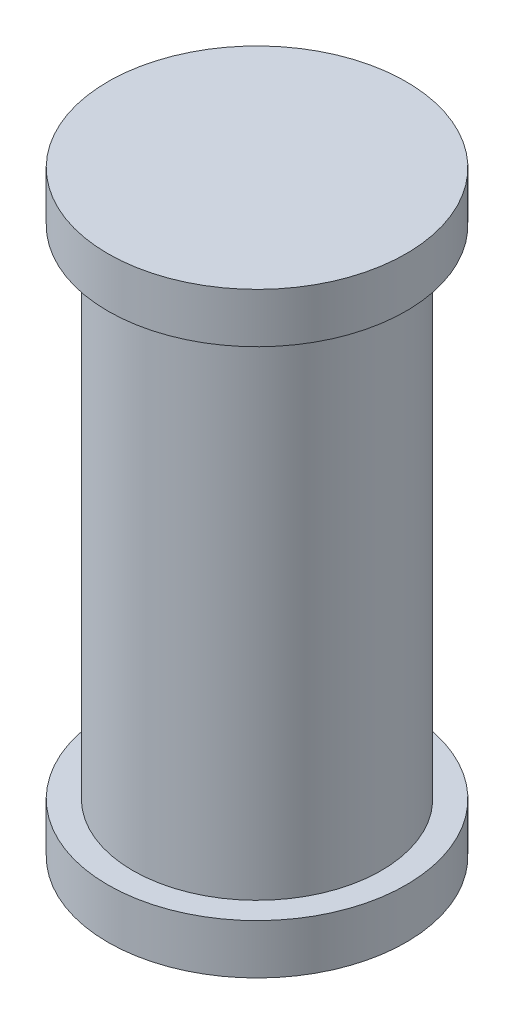
ISO-10303-21;
HEADER;
FILE_DESCRIPTION(('STEP AP214'),'2;1');
FILE_NAME('part.step','',(''),(''),'','','');
FILE_SCHEMA(('AUTOMOTIVE_DESIGN { 1 0 10303 214 1 1 1 1 }'));
ENDSEC;
DATA;
#1=APPLICATION_CONTEXT('core data for automotive mechanical design processes');
#2=APPLICATION_PROTOCOL_DEFINITION('international standard','automotive_design',2000,#1);
#3=PRODUCT_CONTEXT('',#1,'mechanical');
#4=PRODUCT('Part','Part','',(#3));
#5=PRODUCT_RELATED_PRODUCT_CATEGORY('part','',(#4));
#6=PRODUCT_DEFINITION_FORMATION('','',#4);
#7=PRODUCT_DEFINITION_CONTEXT('part definition',#1,'design');
#8=PRODUCT_DEFINITION('design','',#6,#7);
#9=PRODUCT_DEFINITION_SHAPE('','',#8);
#10=(LENGTH_UNIT() NAMED_UNIT(*) SI_UNIT(.MILLI.,.METRE.));
#11=(NAMED_UNIT(*) PLANE_ANGLE_UNIT() SI_UNIT($,.RADIAN.));
#12=(NAMED_UNIT(*) SI_UNIT($,.STERADIAN.) SOLID_ANGLE_UNIT());
#13=UNCERTAINTY_MEASURE_WITH_UNIT(LENGTH_MEASURE(1.E-05),#10,'distance_accuracy_value','');
#14=(GEOMETRIC_REPRESENTATION_CONTEXT(3) GLOBAL_UNCERTAINTY_ASSIGNED_CONTEXT((#13)) GLOBAL_UNIT_ASSIGNED_CONTEXT((#10,
#11,#12)) REPRESENTATION_CONTEXT('',''));
#15=CARTESIAN_POINT('',(0.,0.,0.));
#16=DIRECTION('',(0.,0.,1.));
#17=DIRECTION('',(1.,0.,0.));
#18=AXIS2_PLACEMENT_3D('',#15,#16,#17);
#19=CARTESIAN_POINT('',(0.,10.,0.));
#20=DIRECTION('',(0.,-1.,0.));
#21=DIRECTION('',(0.,0.,-1.));
#22=AXIS2_PLACEMENT_3D('',#19,#20,#21);
#23=CYLINDRICAL_SURFACE('',#22,30.);
#24=CARTESIAN_POINT('',(0.,10.,0.));
#25=DIRECTION('',(0.,1.,0.));
#26=DIRECTION('',(0.,0.,1.));
#27=AXIS2_PLACEMENT_3D('',#24,#25,#26);
#28=CIRCLE('',#27,30.);
#29=CARTESIAN_POINT('',(0.,10.,30.));
#30=VERTEX_POINT('',#29);
#31=EDGE_CURVE('E38',#30,#30,#28,.T.);
#32=ORIENTED_EDGE('',*,*,#31,.F.);
#33=EDGE_LOOP('',(#32));
#34=FACE_BOUND('',#33,.T.);
#35=CARTESIAN_POINT('',(0.,0.,0.));
#36=DIRECTION('',(0.,1.,0.));
#37=DIRECTION('',(0.,0.,1.));
#38=AXIS2_PLACEMENT_3D('',#35,#36,#37);
#39=CIRCLE('',#38,30.);
#40=CARTESIAN_POINT('',(0.,0.,30.));
#41=VERTEX_POINT('',#40);
#42=EDGE_CURVE('E34',#41,#41,#39,.T.);
#43=ORIENTED_EDGE('',*,*,#42,.T.);
#44=EDGE_LOOP('',(#43));
#45=FACE_BOUND('',#44,.T.);
#46=ADVANCED_FACE('F31',(#34,#45),#23,.T.);
#47=CARTESIAN_POINT('',(0.,10.,0.));
#48=DIRECTION('',(0.,1.,0.));
#49=DIRECTION('',(0.,0.,1.));
#50=AXIS2_PLACEMENT_3D('',#47,#48,#49);
#51=PLANE('',#50);
#52=CARTESIAN_POINT('',(0.,10.,0.));
#53=DIRECTION('',(0.,1.,0.));
#54=DIRECTION('',(0.,0.,1.));
#55=AXIS2_PLACEMENT_3D('',#52,#53,#54);
#56=CIRCLE('',#55,25.);
#57=CARTESIAN_POINT('',(0.,10.,25.));
#58=VERTEX_POINT('',#57);
#59=EDGE_CURVE('E10',#58,#58,#56,.T.);
#60=ORIENTED_EDGE('',*,*,#59,.F.);
#61=EDGE_LOOP('',(#60));
#62=FACE_BOUND('',#61,.T.);
#63=ORIENTED_EDGE('',*,*,#31,.T.);
#64=EDGE_LOOP('',(#63));
#65=FACE_BOUND('',#64,.T.);
#66=ADVANCED_FACE('F72',(#62,#65),#51,.T.);
#67=CARTESIAN_POINT('',(0.,0.,0.));
#68=DIRECTION('',(0.,1.,0.));
#69=DIRECTION('',(0.,0.,1.));
#70=AXIS2_PLACEMENT_3D('',#67,#68,#69);
#71=PLANE('',#70);
#72=ORIENTED_EDGE('',*,*,#42,.F.);
#73=EDGE_LOOP('',(#72));
#74=FACE_BOUND('',#73,.T.);
#75=ADVANCED_FACE('F77',(#74),#71,.F.);
#76=CARTESIAN_POINT('',(0.,110.,0.));
#77=DIRECTION('',(0.,-1.,0.));
#78=DIRECTION('',(0.,0.,-1.));
#79=AXIS2_PLACEMENT_3D('',#76,#77,#78);
#80=CYLINDRICAL_SURFACE('',#79,25.);
#81=CARTESIAN_POINT('',(0.,110.,0.));
#82=DIRECTION('',(0.,1.,0.));
#83=DIRECTION('',(0.,0.,1.));
#84=AXIS2_PLACEMENT_3D('',#81,#82,#83);
#85=CIRCLE('',#84,25.);
#86=CARTESIAN_POINT('',(0.,110.,25.));
#87=VERTEX_POINT('',#86);
#88=EDGE_CURVE('E44',#87,#87,#85,.T.);
#89=ORIENTED_EDGE('',*,*,#88,.F.);
#90=EDGE_LOOP('',(#89));
#91=FACE_BOUND('',#90,.T.);
#92=ORIENTED_EDGE('',*,*,#59,.T.);
#93=EDGE_LOOP('',(#92));
#94=FACE_BOUND('',#93,.T.);
#95=ADVANCED_FACE('F59',(#91,#94),#80,.T.);
#96=CARTESIAN_POINT('',(0.,120.,0.));
#97=DIRECTION('',(0.,-1.,0.));
#98=DIRECTION('',(0.,0.,-1.));
#99=AXIS2_PLACEMENT_3D('',#96,#97,#98);
#100=CYLINDRICAL_SURFACE('',#99,30.);
#101=CARTESIAN_POINT('',(0.,120.,0.));
#102=DIRECTION('',(0.,1.,0.));
#103=DIRECTION('',(0.,0.,1.));
#104=AXIS2_PLACEMENT_3D('',#101,#102,#103);
#105=CIRCLE('',#104,30.);
#106=CARTESIAN_POINT('',(0.,120.,30.));
#107=VERTEX_POINT('',#106);
#108=EDGE_CURVE('E47',#107,#107,#105,.T.);
#109=ORIENTED_EDGE('',*,*,#108,.F.);
#110=EDGE_LOOP('',(#109));
#111=FACE_BOUND('',#110,.T.);
#112=CARTESIAN_POINT('',(0.,110.,0.));
#113=DIRECTION('',(0.,1.,0.));
#114=DIRECTION('',(0.,0.,1.));
#115=AXIS2_PLACEMENT_3D('',#112,#113,#114);
#116=CIRCLE('',#115,30.);
#117=CARTESIAN_POINT('',(0.,110.,30.));
#118=VERTEX_POINT('',#117);
#119=EDGE_CURVE('E48',#118,#118,#116,.T.);
#120=ORIENTED_EDGE('',*,*,#119,.T.);
#121=EDGE_LOOP('',(#120));
#122=FACE_BOUND('',#121,.T.);
#123=ADVANCED_FACE('F56',(#111,#122),#100,.T.);
#124=CARTESIAN_POINT('',(0.,120.,0.));
#125=DIRECTION('',(0.,1.,0.));
#126=DIRECTION('',(0.,0.,1.));
#127=AXIS2_PLACEMENT_3D('',#124,#125,#126);
#128=PLANE('',#127);
#129=ORIENTED_EDGE('',*,*,#108,.T.);
#130=EDGE_LOOP('',(#129));
#131=FACE_BOUND('',#130,.T.);
#132=ADVANCED_FACE('F54',(#131),#128,.T.);
#133=CARTESIAN_POINT('',(0.,110.,0.));
#134=DIRECTION('',(0.,1.,0.));
#135=DIRECTION('',(0.,0.,1.));
#136=AXIS2_PLACEMENT_3D('',#133,#134,#135);
#137=PLANE('',#136);
#138=ORIENTED_EDGE('',*,*,#88,.T.);
#139=EDGE_LOOP('',(#138));
#140=FACE_BOUND('',#139,.T.);
#141=ORIENTED_EDGE('',*,*,#119,.F.);
#142=EDGE_LOOP('',(#141));
#143=FACE_BOUND('',#142,.T.);
#144=ADVANCED_FACE('F63',(#140,#143),#137,.F.);
#145=CLOSED_SHELL('',(#46,#66,#75,#95,#123,#132,#144));
#146=MANIFOLD_SOLID_BREP('B2',#145);
#147=ADVANCED_BREP_SHAPE_REPRESENTATION('',(#18,#146),#14);
#148=SHAPE_DEFINITION_REPRESENTATION(#9,#147);
ENDSEC;
END-ISO-10303-21;
